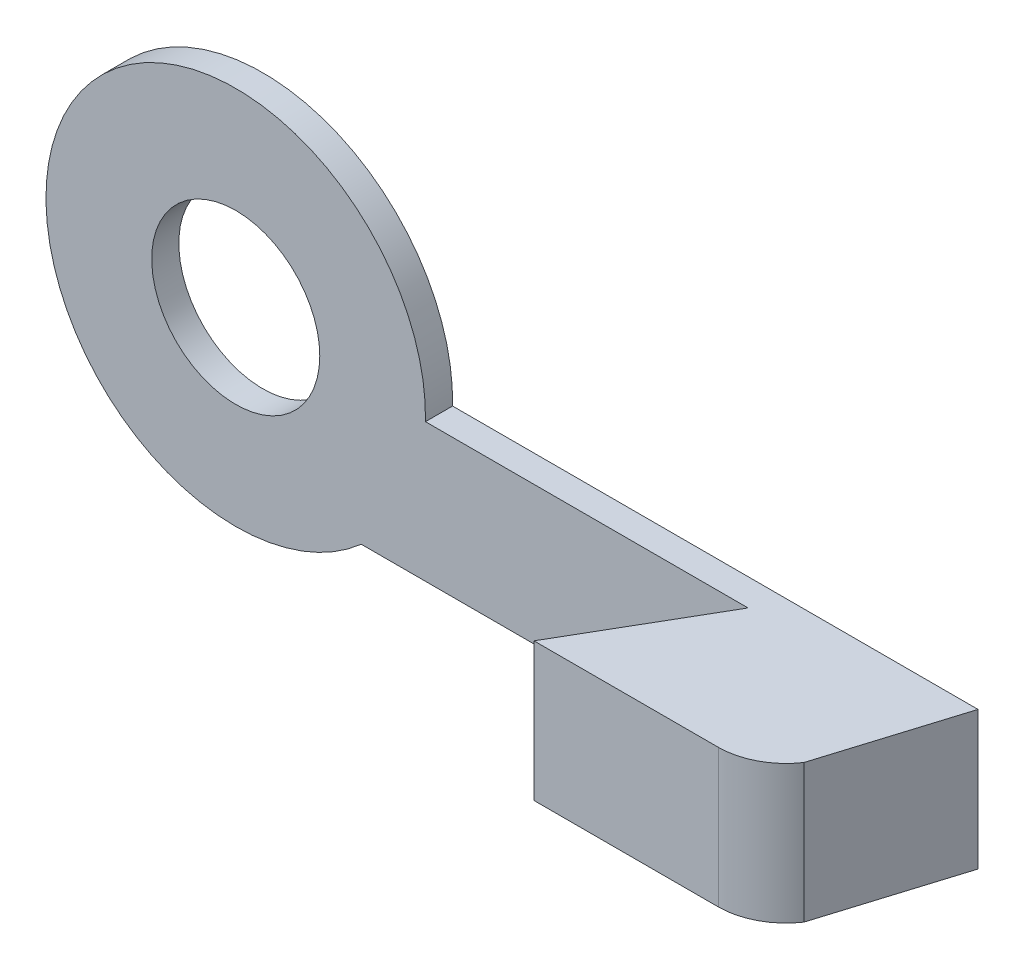
ISO-10303-21;
HEADER;
FILE_DESCRIPTION(('STEP AP214'),'2;1');
FILE_NAME('part.step','',(''),(''),'','','');
FILE_SCHEMA(('AUTOMOTIVE_DESIGN { 1 0 10303 214 1 1 1 1 }'));
ENDSEC;
DATA;
#1=APPLICATION_CONTEXT('core data for automotive mechanical design processes');
#2=APPLICATION_PROTOCOL_DEFINITION('international standard','automotive_design',2000,#1);
#3=PRODUCT_CONTEXT('',#1,'mechanical');
#4=PRODUCT('Part','Part','',(#3));
#5=PRODUCT_RELATED_PRODUCT_CATEGORY('part','',(#4));
#6=PRODUCT_DEFINITION_FORMATION('','',#4);
#7=PRODUCT_DEFINITION_CONTEXT('part definition',#1,'design');
#8=PRODUCT_DEFINITION('design','',#6,#7);
#9=PRODUCT_DEFINITION_SHAPE('','',#8);
#10=(LENGTH_UNIT() NAMED_UNIT(*) SI_UNIT(.MILLI.,.METRE.));
#11=(NAMED_UNIT(*) PLANE_ANGLE_UNIT() SI_UNIT($,.RADIAN.));
#12=(NAMED_UNIT(*) SI_UNIT($,.STERADIAN.) SOLID_ANGLE_UNIT());
#13=UNCERTAINTY_MEASURE_WITH_UNIT(LENGTH_MEASURE(1.E-05),#10,'distance_accuracy_value','');
#14=(GEOMETRIC_REPRESENTATION_CONTEXT(3) GLOBAL_UNCERTAINTY_ASSIGNED_CONTEXT((#13)) GLOBAL_UNIT_ASSIGNED_CONTEXT((#10,
#11,#12)) REPRESENTATION_CONTEXT('',''));
#15=CARTESIAN_POINT('',(0.,0.,0.));
#16=DIRECTION('',(0.,0.,1.));
#17=DIRECTION('',(1.,0.,0.));
#18=AXIS2_PLACEMENT_3D('',#15,#16,#17);
#19=CARTESIAN_POINT('',(-3.9,5.1,-3.5));
#20=DIRECTION('',(0.,0.,1.));
#21=DIRECTION('',(1.,0.,0.));
#22=AXIS2_PLACEMENT_3D('',#19,#20,#21);
#23=PLANE('',#22);
#24=CARTESIAN_POINT('',(-22.8,5.25,-3.5));
#25=DIRECTION('',(0.,0.,1.));
#26=DIRECTION('',(1.,0.,0.));
#27=AXIS2_PLACEMENT_3D('',#24,#25,#26);
#28=CIRCLE('',#27,3.1);
#29=CARTESIAN_POINT('',(-19.7,5.25,-3.5));
#30=VERTEX_POINT('',#29);
#31=EDGE_CURVE('E120',#30,#30,#28,.T.);
#32=ORIENTED_EDGE('',*,*,#31,.T.);
#33=EDGE_LOOP('',(#32));
#34=FACE_BOUND('',#33,.T.);
#35=DIRECTION('',(-1.,0.,0.));
#36=VECTOR('',#35,1.);
#37=CARTESIAN_POINT('',(-3.9,0.,-3.5));
#38=LINE('',#37,#36);
#39=CARTESIAN_POINT('',(3.58008488766819,0.,-3.5));
#40=VERTEX_POINT('',#39);
#41=CARTESIAN_POINT('',(-18.169935205637,0.,-3.5));
#42=VERTEX_POINT('',#41);
#43=EDGE_CURVE('E90',#40,#42,#38,.T.);
#44=ORIENTED_EDGE('',*,*,#43,.T.);
#45=CARTESIAN_POINT('',(-22.8,5.25,-3.5));
#46=DIRECTION('',(0.,0.,-1.));
#47=DIRECTION('',(-1.,0.,0.));
#48=AXIS2_PLACEMENT_3D('',#45,#46,#47);
#49=CIRCLE('',#48,7.);
#50=CARTESIAN_POINT('',(-15.801607327393,5.1,-3.5));
#51=VERTEX_POINT('',#50);
#52=EDGE_CURVE('E127',#42,#51,#49,.T.);
#53=ORIENTED_EDGE('',*,*,#52,.T.);
#54=DIRECTION('',(-1.,0.,0.));
#55=VECTOR('',#54,1.);
#56=CARTESIAN_POINT('',(-3.9,5.1,-3.5));
#57=LINE('',#56,#55);
#58=CARTESIAN_POINT('',(3.58008488766819,5.1,-3.5));
#59=VERTEX_POINT('',#58);
#60=EDGE_CURVE('E54',#59,#51,#57,.T.);
#61=ORIENTED_EDGE('',*,*,#60,.F.);
#62=DIRECTION('',(0.,-1.,0.));
#63=VECTOR('',#62,1.);
#64=CARTESIAN_POINT('',(3.58008488766819,10.8643020026927,-3.5));
#65=LINE('',#64,#63);
#66=EDGE_CURVE('E105',#59,#40,#65,.T.);
#67=ORIENTED_EDGE('',*,*,#66,.T.);
#68=EDGE_LOOP('',(#44,#53,#61,#67));
#69=FACE_BOUND('',#68,.T.);
#70=ADVANCED_FACE('F33',(#34,#69),#23,.F.);
#71=CARTESIAN_POINT('',(0.,5.1,2.5));
#72=DIRECTION('',(0.,0.,-1.));
#73=DIRECTION('',(-1.,0.,0.));
#74=AXIS2_PLACEMENT_3D('',#71,#72,#73);
#75=PLANE('',#74);
#76=DIRECTION('',(1.,0.,0.));
#77=VECTOR('',#76,1.);
#78=CARTESIAN_POINT('',(0.,0.,2.5));
#79=LINE('',#78,#77);
#80=CARTESIAN_POINT('',(-6.8,0.,2.5));
#81=VERTEX_POINT('',#80);
#82=CARTESIAN_POINT('',(0.,0.,2.5));
#83=VERTEX_POINT('',#82);
#84=EDGE_CURVE('E100',#81,#83,#79,.T.);
#85=ORIENTED_EDGE('',*,*,#84,.T.);
#86=DIRECTION('',(0.,-1.,0.));
#87=VECTOR('',#86,1.);
#88=CARTESIAN_POINT('',(0.,5.1,2.5));
#89=LINE('',#88,#87);
#90=CARTESIAN_POINT('',(0.,5.1,2.5));
#91=VERTEX_POINT('',#90);
#92=EDGE_CURVE('E40',#91,#83,#89,.T.);
#93=ORIENTED_EDGE('',*,*,#92,.F.);
#94=DIRECTION('',(1.,0.,0.));
#95=VECTOR('',#94,1.);
#96=CARTESIAN_POINT('',(0.,5.1,2.5));
#97=LINE('',#96,#95);
#98=CARTESIAN_POINT('',(-6.8,5.1,2.5));
#99=VERTEX_POINT('',#98);
#100=EDGE_CURVE('E141',#99,#91,#97,.T.);
#101=ORIENTED_EDGE('',*,*,#100,.F.);
#102=DIRECTION('',(0.,-1.,0.));
#103=VECTOR('',#102,1.);
#104=CARTESIAN_POINT('',(-6.8,10.8801384066474,2.5));
#105=LINE('',#104,#103);
#106=EDGE_CURVE('E114',#99,#81,#105,.T.);
#107=ORIENTED_EDGE('',*,*,#106,.T.);
#108=EDGE_LOOP('',(#85,#93,#101,#107));
#109=FACE_BOUND('',#108,.T.);
#110=ADVANCED_FACE('F172',(#109),#75,.F.);
#111=CARTESIAN_POINT('',(0.,5.1,0.));
#112=DIRECTION('',(0.,-1.,0.));
#113=DIRECTION('',(0.,0.,-1.));
#114=AXIS2_PLACEMENT_3D('',#111,#112,#113);
#115=CYLINDRICAL_SURFACE('',#114,2.5);
#116=CARTESIAN_POINT('',(0.,0.,0.));
#117=DIRECTION('',(0.,1.,0.));
#118=DIRECTION('',(0.,0.,-1.));
#119=AXIS2_PLACEMENT_3D('',#116,#117,#118);
#120=CIRCLE('',#119,2.5);
#121=CARTESIAN_POINT('',(2.0652457362394,0.,1.40881512234394));
#122=VERTEX_POINT('',#121);
#123=EDGE_CURVE('E142',#83,#122,#120,.T.);
#124=ORIENTED_EDGE('',*,*,#123,.T.);
#125=DIRECTION('',(0.,-1.,0.));
#126=VECTOR('',#125,1.);
#127=CARTESIAN_POINT('',(2.0652457362394,5.1,1.40881512234395));
#128=LINE('',#127,#126);
#129=CARTESIAN_POINT('',(2.0652457362394,5.1,1.40881512234394));
#130=VERTEX_POINT('',#129);
#131=EDGE_CURVE('E46',#122,#130,#128,.F.);
#132=ORIENTED_EDGE('',*,*,#131,.T.);
#133=CARTESIAN_POINT('',(0.,5.1,0.));
#134=DIRECTION('',(0.,1.,0.));
#135=DIRECTION('',(0.,0.,-1.));
#136=AXIS2_PLACEMENT_3D('',#133,#134,#135);
#137=CIRCLE('',#136,2.5);
#138=EDGE_CURVE('E144',#91,#130,#137,.T.);
#139=ORIENTED_EDGE('',*,*,#138,.F.);
#140=ORIENTED_EDGE('',*,*,#92,.T.);
#141=EDGE_LOOP('',(#124,#132,#139,#140));
#142=FACE_BOUND('',#141,.T.);
#143=ADVANCED_FACE('F177',(#142),#115,.T.);
#144=CARTESIAN_POINT('',(-0.999999999999999,5.1,0.));
#145=DIRECTION('',(0.,-1.,0.));
#146=DIRECTION('',(0.,0.,-1.));
#147=AXIS2_PLACEMENT_3D('',#144,#145,#146);
#148=PLANE('',#147);
#149=DIRECTION('',(-0.294874299917983,0.,0.955536052301471));
#150=VECTOR('',#149,1.);
#151=CARTESIAN_POINT('',(2.5,5.1,0.));
#152=LINE('',#151,#150);
#153=EDGE_CURVE('E106',#59,#130,#152,.T.);
#154=ORIENTED_EDGE('',*,*,#153,.F.);
#155=ORIENTED_EDGE('',*,*,#60,.T.);
#156=DIRECTION('',(0.,0.,-1.));
#157=VECTOR('',#156,1.);
#158=CARTESIAN_POINT('',(-15.801607327393,5.1,-2.5));
#159=LINE('',#158,#157);
#160=CARTESIAN_POINT('',(-15.801607327393,5.1,-2.5));
#161=VERTEX_POINT('',#160);
#162=EDGE_CURVE('E130',#51,#161,#159,.F.);
#163=ORIENTED_EDGE('',*,*,#162,.T.);
#164=DIRECTION('',(1.,0.,0.));
#165=VECTOR('',#164,1.);
#166=CARTESIAN_POINT('',(-22.8,5.1,-2.5));
#167=LINE('',#166,#165);
#168=CARTESIAN_POINT('',(-3.9,5.1,-2.5));
#169=VERTEX_POINT('',#168);
#170=EDGE_CURVE('E135',#161,#169,#167,.T.);
#171=ORIENTED_EDGE('',*,*,#170,.T.);
#172=DIRECTION('',(-0.501718089771846,0.,0.865031189261803));
#173=VECTOR('',#172,1.);
#174=CARTESIAN_POINT('',(-6.8,5.1,2.5));
#175=LINE('',#174,#173);
#176=EDGE_CURVE('E117',#169,#99,#175,.T.);
#177=ORIENTED_EDGE('',*,*,#176,.T.);
#178=ORIENTED_EDGE('',*,*,#100,.T.);
#179=ORIENTED_EDGE('',*,*,#138,.T.);
#180=EDGE_LOOP('',(#154,#155,#163,#171,#177,#178,#179));
#181=FACE_BOUND('',#180,.T.);
#182=ADVANCED_FACE('F182',(#181),#148,.F.);
#183=CARTESIAN_POINT('',(-0.999999999999999,0.,0.));
#184=DIRECTION('',(0.,-1.,0.));
#185=DIRECTION('',(0.,0.,-1.));
#186=AXIS2_PLACEMENT_3D('',#183,#184,#185);
#187=PLANE('',#186);
#188=ORIENTED_EDGE('',*,*,#43,.F.);
#189=DIRECTION('',(0.294874299917983,0.,-0.955536052301471));
#190=VECTOR('',#189,1.);
#191=CARTESIAN_POINT('',(2.19567201536758,0.,0.986170585640762));
#192=LINE('',#191,#190);
#193=EDGE_CURVE('E11',#122,#40,#192,.T.);
#194=ORIENTED_EDGE('',*,*,#193,.F.);
#195=ORIENTED_EDGE('',*,*,#123,.F.);
#196=ORIENTED_EDGE('',*,*,#84,.F.);
#197=DIRECTION('',(0.501718089771846,0.,-0.865031189261803));
#198=VECTOR('',#197,1.);
#199=CARTESIAN_POINT('',(-6.8,0.,2.5));
#200=LINE('',#199,#198);
#201=CARTESIAN_POINT('',(-3.9,0.,-2.5));
#202=VERTEX_POINT('',#201);
#203=EDGE_CURVE('E111',#81,#202,#200,.T.);
#204=ORIENTED_EDGE('',*,*,#203,.T.);
#205=DIRECTION('',(1.,0.,0.));
#206=VECTOR('',#205,1.);
#207=CARTESIAN_POINT('',(-22.8,0.,-2.5));
#208=LINE('',#207,#206);
#209=CARTESIAN_POINT('',(-18.169935205637,0.,-2.5));
#210=VERTEX_POINT('',#209);
#211=EDGE_CURVE('E101',#210,#202,#208,.T.);
#212=ORIENTED_EDGE('',*,*,#211,.F.);
#213=DIRECTION('',(0.,0.,-1.));
#214=VECTOR('',#213,1.);
#215=CARTESIAN_POINT('',(-18.169935205637,0.,-2.5));
#216=LINE('',#215,#214);
#217=EDGE_CURVE('E95',#42,#210,#216,.F.);
#218=ORIENTED_EDGE('',*,*,#217,.F.);
#219=EDGE_LOOP('',(#188,#194,#195,#196,#204,#212,#218));
#220=FACE_BOUND('',#219,.T.);
#221=ADVANCED_FACE('F91',(#220),#187,.T.);
#222=CARTESIAN_POINT('',(-22.8,5.1,-2.5));
#223=DIRECTION('',(0.,0.,-1.));
#224=DIRECTION('',(0.,1.,0.));
#225=AXIS2_PLACEMENT_3D('',#222,#223,#224);
#226=PLANE('',#225);
#227=CARTESIAN_POINT('',(-22.8,5.25,-2.5));
#228=DIRECTION('',(0.,0.,-1.));
#229=DIRECTION('',(0.,1.,0.));
#230=AXIS2_PLACEMENT_3D('',#227,#228,#229);
#231=CIRCLE('',#230,3.1);
#232=CARTESIAN_POINT('',(-22.8,8.35,-2.5));
#233=VERTEX_POINT('',#232);
#234=EDGE_CURVE('E123',#233,#233,#231,.T.);
#235=ORIENTED_EDGE('',*,*,#234,.T.);
#236=EDGE_LOOP('',(#235));
#237=FACE_BOUND('',#236,.T.);
#238=ORIENTED_EDGE('',*,*,#170,.F.);
#239=CARTESIAN_POINT('',(-22.8,5.25,-2.5));
#240=DIRECTION('',(0.,0.,-1.));
#241=DIRECTION('',(-1.,0.,0.));
#242=AXIS2_PLACEMENT_3D('',#239,#240,#241);
#243=CIRCLE('',#242,7.);
#244=EDGE_CURVE('E124',#210,#161,#243,.T.);
#245=ORIENTED_EDGE('',*,*,#244,.F.);
#246=ORIENTED_EDGE('',*,*,#211,.T.);
#247=DIRECTION('',(0.,1.,0.));
#248=VECTOR('',#247,1.);
#249=CARTESIAN_POINT('',(-3.9,5.1,-2.5));
#250=LINE('',#249,#248);
#251=EDGE_CURVE('E132',#202,#169,#250,.T.);
#252=ORIENTED_EDGE('',*,*,#251,.T.);
#253=EDGE_LOOP('',(#238,#245,#246,#252));
#254=FACE_BOUND('',#253,.T.);
#255=ADVANCED_FACE('F153',(#237,#254),#226,.F.);
#256=CARTESIAN_POINT('',(-22.8,5.25,-2.5));
#257=DIRECTION('',(0.,0.,-1.));
#258=DIRECTION('',(-1.,0.,0.));
#259=AXIS2_PLACEMENT_3D('',#256,#257,#258);
#260=CYLINDRICAL_SURFACE('',#259,7.);
#261=ORIENTED_EDGE('',*,*,#162,.F.);
#262=ORIENTED_EDGE('',*,*,#52,.F.);
#263=ORIENTED_EDGE('',*,*,#217,.T.);
#264=ORIENTED_EDGE('',*,*,#244,.T.);
#265=EDGE_LOOP('',(#261,#262,#263,#264));
#266=FACE_BOUND('',#265,.T.);
#267=ADVANCED_FACE('F159',(#266),#260,.T.);
#268=CARTESIAN_POINT('',(-22.8,5.25,-3.5));
#269=DIRECTION('',(0.,0.,1.));
#270=DIRECTION('',(1.,0.,0.));
#271=AXIS2_PLACEMENT_3D('',#268,#269,#270);
#272=CYLINDRICAL_SURFACE('',#271,3.1);
#273=ORIENTED_EDGE('',*,*,#31,.F.);
#274=EDGE_LOOP('',(#273));
#275=FACE_BOUND('',#274,.T.);
#276=ORIENTED_EDGE('',*,*,#234,.F.);
#277=EDGE_LOOP('',(#276));
#278=FACE_BOUND('',#277,.T.);
#279=ADVANCED_FACE('F156',(#275,#278),#272,.F.);
#280=CARTESIAN_POINT('',(-6.8,10.8801384066474,2.5));
#281=DIRECTION('',(-0.865031189261803,0.,-0.501718089771846));
#282=DIRECTION('',(-0.501718089771846,0.,0.865031189261803));
#283=AXIS2_PLACEMENT_3D('',#280,#281,#282);
#284=PLANE('',#283);
#285=ORIENTED_EDGE('',*,*,#176,.F.);
#286=ORIENTED_EDGE('',*,*,#251,.F.);
#287=ORIENTED_EDGE('',*,*,#203,.F.);
#288=ORIENTED_EDGE('',*,*,#106,.F.);
#289=EDGE_LOOP('',(#285,#286,#287,#288));
#290=FACE_BOUND('',#289,.T.);
#291=ADVANCED_FACE('F158',(#290),#284,.T.);
#292=CARTESIAN_POINT('',(2.5,-4.9,0.));
#293=DIRECTION('',(-0.955536052301471,0.,-0.294874299917983));
#294=DIRECTION('',(-0.294874299917983,0.,0.955536052301471));
#295=AXIS2_PLACEMENT_3D('',#292,#293,#294);
#296=PLANE('',#295);
#297=ORIENTED_EDGE('',*,*,#193,.T.);
#298=ORIENTED_EDGE('',*,*,#66,.F.);
#299=ORIENTED_EDGE('',*,*,#153,.T.);
#300=ORIENTED_EDGE('',*,*,#131,.F.);
#301=EDGE_LOOP('',(#297,#298,#299,#300));
#302=FACE_BOUND('',#301,.T.);
#303=ADVANCED_FACE('F104',(#302),#296,.F.);
#304=CLOSED_SHELL('',(#70,#110,#143,#182,#221,#255,#267,#279,#291,#303));
#305=MANIFOLD_SOLID_BREP('B2',#304);
#306=ADVANCED_BREP_SHAPE_REPRESENTATION('',(#18,#305),#14);
#307=SHAPE_DEFINITION_REPRESENTATION(#9,#306);
ENDSEC;
END-ISO-10303-21;
